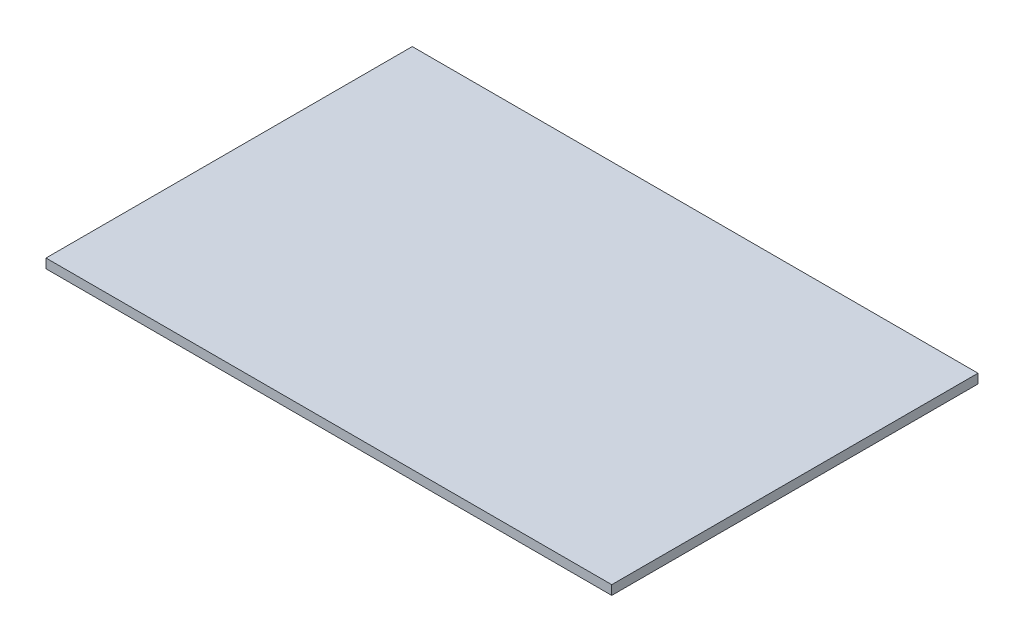
ISO-10303-21;
HEADER;
FILE_DESCRIPTION(('STEP AP214'),'2;1');
FILE_NAME('part.step','',(''),(''),'','','');
FILE_SCHEMA(('AUTOMOTIVE_DESIGN { 1 0 10303 214 1 1 1 1 }'));
ENDSEC;
DATA;
#1=APPLICATION_CONTEXT('core data for automotive mechanical design processes');
#2=APPLICATION_PROTOCOL_DEFINITION('international standard','automotive_design',2000,#1);
#3=PRODUCT_CONTEXT('',#1,'mechanical');
#4=PRODUCT('Part','Part','',(#3));
#5=PRODUCT_RELATED_PRODUCT_CATEGORY('part','',(#4));
#6=PRODUCT_DEFINITION_FORMATION('','',#4);
#7=PRODUCT_DEFINITION_CONTEXT('part definition',#1,'design');
#8=PRODUCT_DEFINITION('design','',#6,#7);
#9=PRODUCT_DEFINITION_SHAPE('','',#8);
#10=(LENGTH_UNIT() NAMED_UNIT(*) SI_UNIT(.MILLI.,.METRE.));
#11=(NAMED_UNIT(*) PLANE_ANGLE_UNIT() SI_UNIT($,.RADIAN.));
#12=(NAMED_UNIT(*) SI_UNIT($,.STERADIAN.) SOLID_ANGLE_UNIT());
#13=UNCERTAINTY_MEASURE_WITH_UNIT(LENGTH_MEASURE(1.E-05),#10,'distance_accuracy_value','');
#14=(GEOMETRIC_REPRESENTATION_CONTEXT(3) GLOBAL_UNCERTAINTY_ASSIGNED_CONTEXT((#13)) GLOBAL_UNIT_ASSIGNED_CONTEXT((#10,
#11,#12)) REPRESENTATION_CONTEXT('',''));
#15=CARTESIAN_POINT('',(0.,0.,0.));
#16=DIRECTION('',(0.,0.,1.));
#17=DIRECTION('',(1.,0.,0.));
#18=AXIS2_PLACEMENT_3D('',#15,#16,#17);
#19=CARTESIAN_POINT('',(363.,12.,-235.));
#20=DIRECTION('',(-1.,0.,0.));
#21=DIRECTION('',(0.,0.,1.));
#22=AXIS2_PLACEMENT_3D('',#19,#20,#21);
#23=PLANE('',#22);
#24=DIRECTION('',(0.,0.,-1.));
#25=VECTOR('',#24,1.);
#26=CARTESIAN_POINT('',(363.,0.,-235.));
#27=LINE('',#26,#25);
#28=CARTESIAN_POINT('',(363.,0.,235.));
#29=VERTEX_POINT('',#28);
#30=CARTESIAN_POINT('',(363.,0.,-235.));
#31=VERTEX_POINT('',#30);
#32=EDGE_CURVE('E96',#29,#31,#27,.T.);
#33=ORIENTED_EDGE('',*,*,#32,.T.);
#34=DIRECTION('',(0.,-1.,0.));
#35=VECTOR('',#34,1.);
#36=CARTESIAN_POINT('',(363.,12.,-235.));
#37=LINE('',#36,#35);
#38=CARTESIAN_POINT('',(363.,12.,-235.));
#39=VERTEX_POINT('',#38);
#40=EDGE_CURVE('E11',#39,#31,#37,.T.);
#41=ORIENTED_EDGE('',*,*,#40,.F.);
#42=DIRECTION('',(0.,0.,-1.));
#43=VECTOR('',#42,1.);
#44=CARTESIAN_POINT('',(363.,12.,-235.));
#45=LINE('',#44,#43);
#46=CARTESIAN_POINT('',(363.,12.,235.));
#47=VERTEX_POINT('',#46);
#48=EDGE_CURVE('E84',#47,#39,#45,.T.);
#49=ORIENTED_EDGE('',*,*,#48,.F.);
#50=DIRECTION('',(0.,-1.,0.));
#51=VECTOR('',#50,1.);
#52=CARTESIAN_POINT('',(363.,12.,235.));
#53=LINE('',#52,#51);
#54=EDGE_CURVE('E92',#47,#29,#53,.T.);
#55=ORIENTED_EDGE('',*,*,#54,.T.);
#56=EDGE_LOOP('',(#33,#41,#49,#55));
#57=FACE_BOUND('',#56,.T.);
#58=ADVANCED_FACE('F33',(#57),#23,.F.);
#59=CARTESIAN_POINT('',(-363.,12.,-235.));
#60=DIRECTION('',(0.,0.,1.));
#61=DIRECTION('',(1.,0.,0.));
#62=AXIS2_PLACEMENT_3D('',#59,#60,#61);
#63=PLANE('',#62);
#64=DIRECTION('',(-1.,0.,0.));
#65=VECTOR('',#64,1.);
#66=CARTESIAN_POINT('',(-363.,0.,-235.));
#67=LINE('',#66,#65);
#68=CARTESIAN_POINT('',(-363.,0.,-235.));
#69=VERTEX_POINT('',#68);
#70=EDGE_CURVE('E88',#31,#69,#67,.T.);
#71=ORIENTED_EDGE('',*,*,#70,.T.);
#72=DIRECTION('',(0.,-1.,0.));
#73=VECTOR('',#72,1.);
#74=CARTESIAN_POINT('',(-363.,12.,-235.));
#75=LINE('',#74,#73);
#76=CARTESIAN_POINT('',(-363.,12.,-235.));
#77=VERTEX_POINT('',#76);
#78=EDGE_CURVE('E41',#77,#69,#75,.T.);
#79=ORIENTED_EDGE('',*,*,#78,.F.);
#80=DIRECTION('',(-1.,0.,0.));
#81=VECTOR('',#80,1.);
#82=CARTESIAN_POINT('',(-363.,12.,-235.));
#83=LINE('',#82,#81);
#84=EDGE_CURVE('E79',#39,#77,#83,.T.);
#85=ORIENTED_EDGE('',*,*,#84,.F.);
#86=ORIENTED_EDGE('',*,*,#40,.T.);
#87=EDGE_LOOP('',(#71,#79,#85,#86));
#88=FACE_BOUND('',#87,.T.);
#89=ADVANCED_FACE('F87',(#88),#63,.F.);
#90=CARTESIAN_POINT('',(-363.,12.,-235.));
#91=DIRECTION('',(1.,0.,0.));
#92=DIRECTION('',(0.,0.,-1.));
#93=AXIS2_PLACEMENT_3D('',#90,#91,#92);
#94=PLANE('',#93);
#95=DIRECTION('',(0.,0.,1.));
#96=VECTOR('',#95,1.);
#97=CARTESIAN_POINT('',(-363.,0.,-235.));
#98=LINE('',#97,#96);
#99=CARTESIAN_POINT('',(-363.,0.,235.));
#100=VERTEX_POINT('',#99);
#101=EDGE_CURVE('E66',#69,#100,#98,.T.);
#102=ORIENTED_EDGE('',*,*,#101,.T.);
#103=DIRECTION('',(0.,-1.,0.));
#104=VECTOR('',#103,1.);
#105=CARTESIAN_POINT('',(-363.,12.,235.));
#106=LINE('',#105,#104);
#107=CARTESIAN_POINT('',(-363.,12.,235.));
#108=VERTEX_POINT('',#107);
#109=EDGE_CURVE('E89',#108,#100,#106,.T.);
#110=ORIENTED_EDGE('',*,*,#109,.F.);
#111=DIRECTION('',(0.,0.,1.));
#112=VECTOR('',#111,1.);
#113=CARTESIAN_POINT('',(-363.,12.,-235.));
#114=LINE('',#113,#112);
#115=EDGE_CURVE('E82',#77,#108,#114,.T.);
#116=ORIENTED_EDGE('',*,*,#115,.F.);
#117=ORIENTED_EDGE('',*,*,#78,.T.);
#118=EDGE_LOOP('',(#102,#110,#116,#117));
#119=FACE_BOUND('',#118,.T.);
#120=ADVANCED_FACE('F90',(#119),#94,.F.);
#121=CARTESIAN_POINT('',(-363.,12.,235.));
#122=DIRECTION('',(0.,0.,-1.));
#123=DIRECTION('',(-1.,0.,0.));
#124=AXIS2_PLACEMENT_3D('',#121,#122,#123);
#125=PLANE('',#124);
#126=DIRECTION('',(1.,0.,0.));
#127=VECTOR('',#126,1.);
#128=CARTESIAN_POINT('',(-363.,0.,235.));
#129=LINE('',#128,#127);
#130=EDGE_CURVE('E72',#100,#29,#129,.T.);
#131=ORIENTED_EDGE('',*,*,#130,.T.);
#132=ORIENTED_EDGE('',*,*,#54,.F.);
#133=DIRECTION('',(1.,0.,0.));
#134=VECTOR('',#133,1.);
#135=CARTESIAN_POINT('',(-363.,12.,235.));
#136=LINE('',#135,#134);
#137=EDGE_CURVE('E49',#108,#47,#136,.T.);
#138=ORIENTED_EDGE('',*,*,#137,.F.);
#139=ORIENTED_EDGE('',*,*,#109,.T.);
#140=EDGE_LOOP('',(#131,#132,#138,#139));
#141=FACE_BOUND('',#140,.T.);
#142=ADVANCED_FACE('F103',(#141),#125,.F.);
#143=CARTESIAN_POINT('',(0.,12.,0.));
#144=DIRECTION('',(0.,1.,0.));
#145=DIRECTION('',(0.,0.,1.));
#146=AXIS2_PLACEMENT_3D('',#143,#144,#145);
#147=PLANE('',#146);
#148=ORIENTED_EDGE('',*,*,#48,.T.);
#149=ORIENTED_EDGE('',*,*,#84,.T.);
#150=ORIENTED_EDGE('',*,*,#115,.T.);
#151=ORIENTED_EDGE('',*,*,#137,.T.);
#152=EDGE_LOOP('',(#148,#149,#150,#151));
#153=FACE_BOUND('',#152,.T.);
#154=ADVANCED_FACE('F80',(#153),#147,.T.);
#155=CARTESIAN_POINT('',(0.,0.,0.));
#156=DIRECTION('',(0.,1.,0.));
#157=DIRECTION('',(0.,0.,1.));
#158=AXIS2_PLACEMENT_3D('',#155,#156,#157);
#159=PLANE('',#158);
#160=ORIENTED_EDGE('',*,*,#32,.F.);
#161=ORIENTED_EDGE('',*,*,#130,.F.);
#162=ORIENTED_EDGE('',*,*,#101,.F.);
#163=ORIENTED_EDGE('',*,*,#70,.F.);
#164=EDGE_LOOP('',(#160,#161,#162,#163));
#165=FACE_BOUND('',#164,.T.);
#166=ADVANCED_FACE('F106',(#165),#159,.F.);
#167=CLOSED_SHELL('',(#58,#89,#120,#142,#154,#166));
#168=MANIFOLD_SOLID_BREP('B2',#167);
#169=ADVANCED_BREP_SHAPE_REPRESENTATION('',(#18,#168),#14);
#170=SHAPE_DEFINITION_REPRESENTATION(#9,#169);
ENDSEC;
END-ISO-10303-21;
